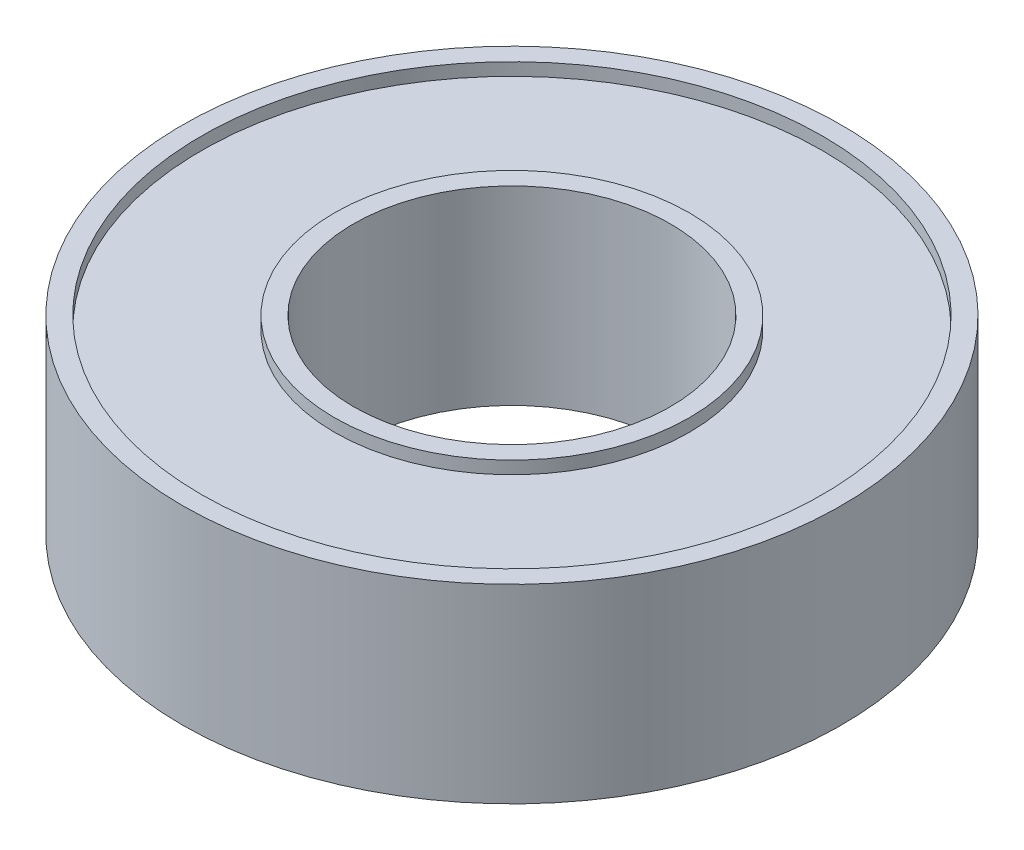
ISO-10303-21;
HEADER;
FILE_DESCRIPTION(('STEP AP214'),'2;1');
FILE_NAME('part.step','',(''),(''),'','','');
FILE_SCHEMA(('AUTOMOTIVE_DESIGN { 1 0 10303 214 1 1 1 1 }'));
ENDSEC;
DATA;
#1=APPLICATION_CONTEXT('core data for automotive mechanical design processes');
#2=APPLICATION_PROTOCOL_DEFINITION('international standard','automotive_design',2000,#1);
#3=PRODUCT_CONTEXT('',#1,'mechanical');
#4=PRODUCT('Part','Part','',(#3));
#5=PRODUCT_RELATED_PRODUCT_CATEGORY('part','',(#4));
#6=PRODUCT_DEFINITION_FORMATION('','',#4);
#7=PRODUCT_DEFINITION_CONTEXT('part definition',#1,'design');
#8=PRODUCT_DEFINITION('design','',#6,#7);
#9=PRODUCT_DEFINITION_SHAPE('','',#8);
#10=(LENGTH_UNIT() NAMED_UNIT(*) SI_UNIT(.MILLI.,.METRE.));
#11=(NAMED_UNIT(*) PLANE_ANGLE_UNIT() SI_UNIT($,.RADIAN.));
#12=(NAMED_UNIT(*) SI_UNIT($,.STERADIAN.) SOLID_ANGLE_UNIT());
#13=UNCERTAINTY_MEASURE_WITH_UNIT(LENGTH_MEASURE(1.E-05),#10,'distance_accuracy_value','');
#14=(GEOMETRIC_REPRESENTATION_CONTEXT(3) GLOBAL_UNCERTAINTY_ASSIGNED_CONTEXT((#13)) GLOBAL_UNIT_ASSIGNED_CONTEXT((#10,
#11,#12)) REPRESENTATION_CONTEXT('',''));
#15=CARTESIAN_POINT('',(0.,0.,0.));
#16=DIRECTION('',(0.,0.,1.));
#17=DIRECTION('',(1.,0.,0.));
#18=AXIS2_PLACEMENT_3D('',#15,#16,#17);
#19=CARTESIAN_POINT('',(0.,0.,0.));
#20=DIRECTION('',(0.,1.,0.));
#21=DIRECTION('',(0.,0.,1.));
#22=AXIS2_PLACEMENT_3D('',#19,#20,#21);
#23=PLANE('',#22);
#24=CARTESIAN_POINT('',(0.,0.,0.));
#25=DIRECTION('',(0.,1.,0.));
#26=DIRECTION('',(0.,0.,1.));
#27=AXIS2_PLACEMENT_3D('',#24,#25,#26);
#28=CIRCLE('',#27,12.5);
#29=CARTESIAN_POINT('',(0.,0.,12.5));
#30=VERTEX_POINT('',#29);
#31=EDGE_CURVE('E53',#30,#30,#28,.T.);
#32=ORIENTED_EDGE('',*,*,#31,.T.);
#33=EDGE_LOOP('',(#32));
#34=FACE_BOUND('',#33,.T.);
#35=CARTESIAN_POINT('',(0.,0.,0.));
#36=DIRECTION('',(0.,-1.,0.));
#37=DIRECTION('',(0.,0.,-1.));
#38=AXIS2_PLACEMENT_3D('',#35,#36,#37);
#39=CIRCLE('',#38,14.);
#40=CARTESIAN_POINT('',(0.,0.,-14.));
#41=VERTEX_POINT('',#40);
#42=EDGE_CURVE('E82',#41,#41,#39,.T.);
#43=ORIENTED_EDGE('',*,*,#42,.T.);
#44=EDGE_LOOP('',(#43));
#45=FACE_BOUND('',#44,.T.);
#46=ADVANCED_FACE('F38',(#34,#45),#23,.F.);
#47=CARTESIAN_POINT('',(0.,15.,0.));
#48=DIRECTION('',(0.,1.,0.));
#49=DIRECTION('',(0.,0.,1.));
#50=AXIS2_PLACEMENT_3D('',#47,#48,#49);
#51=PLANE('',#50);
#52=CARTESIAN_POINT('',(0.,15.,0.));
#53=DIRECTION('',(0.,1.,0.));
#54=DIRECTION('',(0.,0.,1.));
#55=AXIS2_PLACEMENT_3D('',#52,#53,#54);
#56=CIRCLE('',#55,12.5);
#57=CARTESIAN_POINT('',(0.,15.,12.5));
#58=VERTEX_POINT('',#57);
#59=EDGE_CURVE('E51',#58,#58,#56,.T.);
#60=ORIENTED_EDGE('',*,*,#59,.F.);
#61=EDGE_LOOP('',(#60));
#62=FACE_BOUND('',#61,.T.);
#63=CARTESIAN_POINT('',(0.,15.,0.));
#64=DIRECTION('',(0.,1.,0.));
#65=DIRECTION('',(0.,0.,1.));
#66=AXIS2_PLACEMENT_3D('',#63,#64,#65);
#67=CIRCLE('',#66,14.);
#68=CARTESIAN_POINT('',(0.,15.,14.));
#69=VERTEX_POINT('',#68);
#70=EDGE_CURVE('E66',#69,#69,#67,.T.);
#71=ORIENTED_EDGE('',*,*,#70,.T.);
#72=EDGE_LOOP('',(#71));
#73=FACE_BOUND('',#72,.T.);
#74=ADVANCED_FACE('F124',(#62,#73),#51,.T.);
#75=CARTESIAN_POINT('',(0.,15.,0.));
#76=DIRECTION('',(0.,1.,0.));
#77=DIRECTION('',(0.,0.,1.));
#78=AXIS2_PLACEMENT_3D('',#75,#76,#77);
#79=CIRCLE('',#78,24.5);
#80=CARTESIAN_POINT('',(0.,15.,24.5));
#81=VERTEX_POINT('',#80);
#82=EDGE_CURVE('E61',#81,#81,#79,.T.);
#83=ORIENTED_EDGE('',*,*,#82,.F.);
#84=EDGE_LOOP('',(#83));
#85=FACE_BOUND('',#84,.T.);
#86=CARTESIAN_POINT('',(0.,15.,0.));
#87=DIRECTION('',(0.,1.,0.));
#88=DIRECTION('',(0.,0.,1.));
#89=AXIS2_PLACEMENT_3D('',#86,#87,#88);
#90=CIRCLE('',#89,26.);
#91=CARTESIAN_POINT('',(0.,15.,26.));
#92=VERTEX_POINT('',#91);
#93=EDGE_CURVE('E10',#92,#92,#90,.T.);
#94=ORIENTED_EDGE('',*,*,#93,.T.);
#95=EDGE_LOOP('',(#94));
#96=FACE_BOUND('',#95,.T.);
#97=ADVANCED_FACE('F111',(#85,#96),#51,.T.);
#98=CARTESIAN_POINT('',(0.,0.,0.));
#99=DIRECTION('',(0.,-1.,0.));
#100=DIRECTION('',(0.,0.,-1.));
#101=AXIS2_PLACEMENT_3D('',#98,#99,#100);
#102=CIRCLE('',#101,24.5);
#103=CARTESIAN_POINT('',(0.,0.,-24.5));
#104=VERTEX_POINT('',#103);
#105=EDGE_CURVE('E77',#104,#104,#102,.T.);
#106=ORIENTED_EDGE('',*,*,#105,.F.);
#107=EDGE_LOOP('',(#106));
#108=FACE_BOUND('',#107,.T.);
#109=CARTESIAN_POINT('',(0.,0.,0.));
#110=DIRECTION('',(0.,1.,0.));
#111=DIRECTION('',(0.,0.,1.));
#112=AXIS2_PLACEMENT_3D('',#109,#110,#111);
#113=CIRCLE('',#112,26.);
#114=CARTESIAN_POINT('',(0.,0.,26.));
#115=VERTEX_POINT('',#114);
#116=EDGE_CURVE('E42',#115,#115,#113,.T.);
#117=ORIENTED_EDGE('',*,*,#116,.F.);
#118=EDGE_LOOP('',(#117));
#119=FACE_BOUND('',#118,.T.);
#120=ADVANCED_FACE('F108',(#108,#119),#23,.F.);
#121=CARTESIAN_POINT('',(0.,15.,0.));
#122=DIRECTION('',(0.,-1.,0.));
#123=DIRECTION('',(0.,0.,-1.));
#124=AXIS2_PLACEMENT_3D('',#121,#122,#123);
#125=CYLINDRICAL_SURFACE('',#124,26.);
#126=ORIENTED_EDGE('',*,*,#93,.F.);
#127=EDGE_LOOP('',(#126));
#128=FACE_BOUND('',#127,.T.);
#129=ORIENTED_EDGE('',*,*,#116,.T.);
#130=EDGE_LOOP('',(#129));
#131=FACE_BOUND('',#130,.T.);
#132=ADVANCED_FACE('F40',(#128,#131),#125,.T.);
#133=CARTESIAN_POINT('',(0.,15.,0.));
#134=DIRECTION('',(0.,-1.,0.));
#135=DIRECTION('',(0.,0.,-1.));
#136=AXIS2_PLACEMENT_3D('',#133,#134,#135);
#137=CYLINDRICAL_SURFACE('',#136,12.5);
#138=ORIENTED_EDGE('',*,*,#59,.T.);
#139=EDGE_LOOP('',(#138));
#140=FACE_BOUND('',#139,.T.);
#141=ORIENTED_EDGE('',*,*,#31,.F.);
#142=EDGE_LOOP('',(#141));
#143=FACE_BOUND('',#142,.T.);
#144=ADVANCED_FACE('F115',(#140,#143),#137,.F.);
#145=CARTESIAN_POINT('',(0.,14.,0.));
#146=DIRECTION('',(0.,1.,0.));
#147=DIRECTION('',(0.,0.,1.));
#148=AXIS2_PLACEMENT_3D('',#145,#146,#147);
#149=CYLINDRICAL_SURFACE('',#148,14.);
#150=CARTESIAN_POINT('',(0.,14.,0.));
#151=DIRECTION('',(0.,1.,0.));
#152=DIRECTION('',(0.,0.,1.));
#153=AXIS2_PLACEMENT_3D('',#150,#151,#152);
#154=CIRCLE('',#153,14.);
#155=CARTESIAN_POINT('',(0.,14.,14.));
#156=VERTEX_POINT('',#155);
#157=EDGE_CURVE('E65',#156,#156,#154,.T.);
#158=ORIENTED_EDGE('',*,*,#157,.T.);
#159=EDGE_LOOP('',(#158));
#160=FACE_BOUND('',#159,.T.);
#161=ORIENTED_EDGE('',*,*,#70,.F.);
#162=EDGE_LOOP('',(#161));
#163=FACE_BOUND('',#162,.T.);
#164=ADVANCED_FACE('F120',(#160,#163),#149,.T.);
#165=CARTESIAN_POINT('',(0.,14.,0.));
#166=DIRECTION('',(0.,1.,0.));
#167=DIRECTION('',(0.,0.,1.));
#168=AXIS2_PLACEMENT_3D('',#165,#166,#167);
#169=CYLINDRICAL_SURFACE('',#168,24.5);
#170=CARTESIAN_POINT('',(0.,14.,0.));
#171=DIRECTION('',(0.,1.,0.));
#172=DIRECTION('',(0.,0.,1.));
#173=AXIS2_PLACEMENT_3D('',#170,#171,#172);
#174=CIRCLE('',#173,24.5);
#175=CARTESIAN_POINT('',(0.,14.,24.5));
#176=VERTEX_POINT('',#175);
#177=EDGE_CURVE('E57',#176,#176,#174,.T.);
#178=ORIENTED_EDGE('',*,*,#177,.F.);
#179=EDGE_LOOP('',(#178));
#180=FACE_BOUND('',#179,.T.);
#181=ORIENTED_EDGE('',*,*,#82,.T.);
#182=EDGE_LOOP('',(#181));
#183=FACE_BOUND('',#182,.T.);
#184=ADVANCED_FACE('F137',(#180,#183),#169,.F.);
#185=CARTESIAN_POINT('',(0.,14.,0.));
#186=DIRECTION('',(0.,1.,0.));
#187=DIRECTION('',(0.,0.,1.));
#188=AXIS2_PLACEMENT_3D('',#185,#186,#187);
#189=PLANE('',#188);
#190=ORIENTED_EDGE('',*,*,#157,.F.);
#191=EDGE_LOOP('',(#190));
#192=FACE_BOUND('',#191,.T.);
#193=ORIENTED_EDGE('',*,*,#177,.T.);
#194=EDGE_LOOP('',(#193));
#195=FACE_BOUND('',#194,.T.);
#196=ADVANCED_FACE('F141',(#192,#195),#189,.T.);
#197=CARTESIAN_POINT('',(0.,1.,0.));
#198=DIRECTION('',(0.,-1.,0.));
#199=DIRECTION('',(0.,0.,-1.));
#200=AXIS2_PLACEMENT_3D('',#197,#198,#199);
#201=CYLINDRICAL_SURFACE('',#200,14.);
#202=CARTESIAN_POINT('',(0.,1.,0.));
#203=DIRECTION('',(0.,-1.,0.));
#204=DIRECTION('',(0.,0.,-1.));
#205=AXIS2_PLACEMENT_3D('',#202,#203,#204);
#206=CIRCLE('',#205,14.);
#207=CARTESIAN_POINT('',(0.,1.,-14.));
#208=VERTEX_POINT('',#207);
#209=EDGE_CURVE('E81',#208,#208,#206,.T.);
#210=ORIENTED_EDGE('',*,*,#209,.T.);
#211=EDGE_LOOP('',(#210));
#212=FACE_BOUND('',#211,.T.);
#213=ORIENTED_EDGE('',*,*,#42,.F.);
#214=EDGE_LOOP('',(#213));
#215=FACE_BOUND('',#214,.T.);
#216=ADVANCED_FACE('F93',(#212,#215),#201,.T.);
#217=CARTESIAN_POINT('',(0.,1.,0.));
#218=DIRECTION('',(0.,-1.,0.));
#219=DIRECTION('',(0.,0.,-1.));
#220=AXIS2_PLACEMENT_3D('',#217,#218,#219);
#221=CYLINDRICAL_SURFACE('',#220,24.5);
#222=CARTESIAN_POINT('',(0.,1.,0.));
#223=DIRECTION('',(0.,-1.,0.));
#224=DIRECTION('',(0.,0.,-1.));
#225=AXIS2_PLACEMENT_3D('',#222,#223,#224);
#226=CIRCLE('',#225,24.5);
#227=CARTESIAN_POINT('',(0.,1.,-24.5));
#228=VERTEX_POINT('',#227);
#229=EDGE_CURVE('E70',#228,#228,#226,.T.);
#230=ORIENTED_EDGE('',*,*,#229,.F.);
#231=EDGE_LOOP('',(#230));
#232=FACE_BOUND('',#231,.T.);
#233=ORIENTED_EDGE('',*,*,#105,.T.);
#234=EDGE_LOOP('',(#233));
#235=FACE_BOUND('',#234,.T.);
#236=ADVANCED_FACE('F99',(#232,#235),#221,.F.);
#237=CARTESIAN_POINT('',(0.,1.,0.));
#238=DIRECTION('',(0.,-1.,0.));
#239=DIRECTION('',(0.,0.,-1.));
#240=AXIS2_PLACEMENT_3D('',#237,#238,#239);
#241=PLANE('',#240);
#242=ORIENTED_EDGE('',*,*,#209,.F.);
#243=EDGE_LOOP('',(#242));
#244=FACE_BOUND('',#243,.T.);
#245=ORIENTED_EDGE('',*,*,#229,.T.);
#246=EDGE_LOOP('',(#245));
#247=FACE_BOUND('',#246,.T.);
#248=ADVANCED_FACE('F96',(#244,#247),#241,.T.);
#249=CLOSED_SHELL('',(#46,#74,#97,#120,#132,#144,#164,#184,#196,#216,#236,#248));
#250=MANIFOLD_SOLID_BREP('B2',#249);
#251=ADVANCED_BREP_SHAPE_REPRESENTATION('',(#18,#250),#14);
#252=SHAPE_DEFINITION_REPRESENTATION(#9,#251);
ENDSEC;
END-ISO-10303-21;
